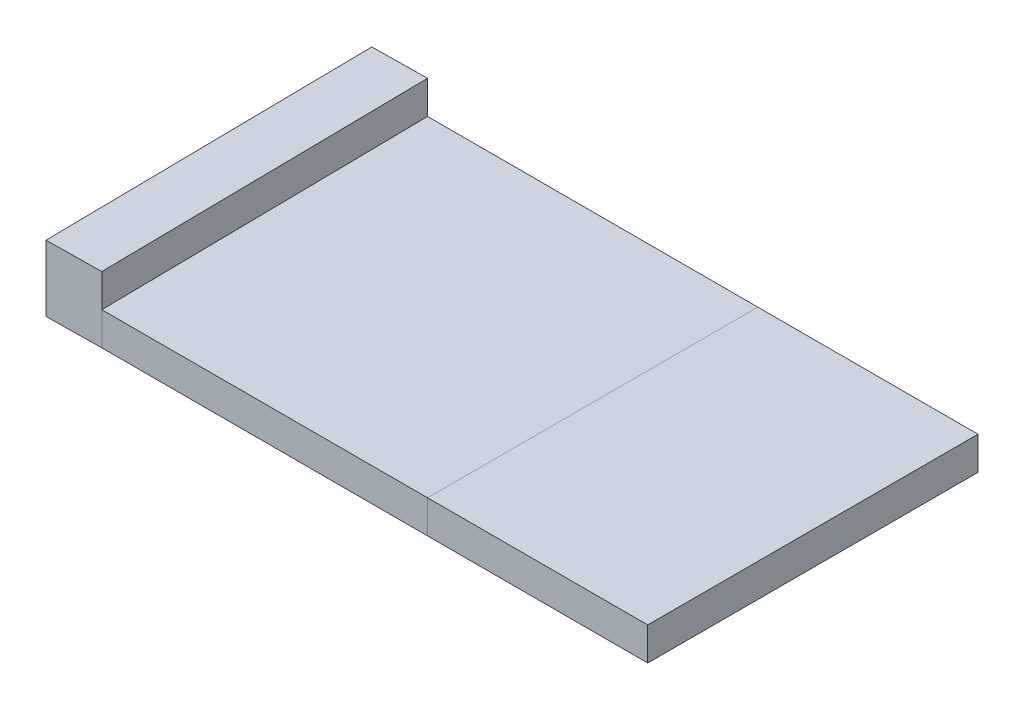
ISO-10303-21;
HEADER;
FILE_DESCRIPTION(('STEP AP214'),'2;1');
FILE_NAME('part.step','',(''),(''),'','','');
FILE_SCHEMA(('AUTOMOTIVE_DESIGN { 1 0 10303 214 1 1 1 1 }'));
ENDSEC;
DATA;
#1=APPLICATION_CONTEXT('core data for automotive mechanical design processes');
#2=APPLICATION_PROTOCOL_DEFINITION('international standard','automotive_design',2000,#1);
#3=PRODUCT_CONTEXT('',#1,'mechanical');
#4=PRODUCT('Part','Part','',(#3));
#5=PRODUCT_RELATED_PRODUCT_CATEGORY('part','',(#4));
#6=PRODUCT_DEFINITION_FORMATION('','',#4);
#7=PRODUCT_DEFINITION_CONTEXT('part definition',#1,'design');
#8=PRODUCT_DEFINITION('design','',#6,#7);
#9=PRODUCT_DEFINITION_SHAPE('','',#8);
#10=(LENGTH_UNIT() NAMED_UNIT(*) SI_UNIT(.MILLI.,.METRE.));
#11=(NAMED_UNIT(*) PLANE_ANGLE_UNIT() SI_UNIT($,.RADIAN.));
#12=(NAMED_UNIT(*) SI_UNIT($,.STERADIAN.) SOLID_ANGLE_UNIT());
#13=UNCERTAINTY_MEASURE_WITH_UNIT(LENGTH_MEASURE(1.E-05),#10,'distance_accuracy_value','');
#14=(GEOMETRIC_REPRESENTATION_CONTEXT(3) GLOBAL_UNCERTAINTY_ASSIGNED_CONTEXT((#13)) GLOBAL_UNIT_ASSIGNED_CONTEXT((#10,
#11,#12)) REPRESENTATION_CONTEXT('',''));
#15=CARTESIAN_POINT('',(0.,0.,0.));
#16=DIRECTION('',(0.,0.,1.));
#17=DIRECTION('',(1.,0.,0.));
#18=AXIS2_PLACEMENT_3D('',#15,#16,#17);
#19=CARTESIAN_POINT('',(495.953237410072,30.,0.));
#20=DIRECTION('',(0.,0.,-1.));
#21=DIRECTION('',(-1.,0.,0.));
#22=AXIS2_PLACEMENT_3D('',#19,#20,#21);
#23=PLANE('',#22);
#24=DIRECTION('',(0.,-1.,0.));
#25=VECTOR('',#24,1.);
#26=CARTESIAN_POINT('',(295.953237410072,30.,0.));
#27=LINE('',#26,#25);
#28=CARTESIAN_POINT('',(295.953237410072,30.,0.));
#29=VERTEX_POINT('',#28);
#30=CARTESIAN_POINT('',(295.953237410072,0.,0.));
#31=VERTEX_POINT('',#30);
#32=EDGE_CURVE('E108',#29,#31,#27,.T.);
#33=ORIENTED_EDGE('',*,*,#32,.T.);
#34=DIRECTION('',(-1.,0.,0.));
#35=VECTOR('',#34,1.);
#36=CARTESIAN_POINT('',(495.953237410072,0.,0.));
#37=LINE('',#36,#35);
#38=CARTESIAN_POINT('',(495.953237410072,0.,0.));
#39=VERTEX_POINT('',#38);
#40=EDGE_CURVE('E12',#39,#31,#37,.T.);
#41=ORIENTED_EDGE('',*,*,#40,.F.);
#42=DIRECTION('',(0.,-1.,0.));
#43=VECTOR('',#42,1.);
#44=CARTESIAN_POINT('',(495.953237410072,30.,0.));
#45=LINE('',#44,#43);
#46=CARTESIAN_POINT('',(495.953237410072,30.,0.));
#47=VERTEX_POINT('',#46);
#48=EDGE_CURVE('E96',#47,#39,#45,.T.);
#49=ORIENTED_EDGE('',*,*,#48,.F.);
#50=DIRECTION('',(-1.,0.,0.));
#51=VECTOR('',#50,1.);
#52=CARTESIAN_POINT('',(495.953237410072,30.,0.));
#53=LINE('',#52,#51);
#54=EDGE_CURVE('E104',#47,#29,#53,.T.);
#55=ORIENTED_EDGE('',*,*,#54,.T.);
#56=EDGE_LOOP('',(#33,#41,#49,#55));
#57=FACE_BOUND('',#56,.T.);
#58=ADVANCED_FACE('F45',(#57),#23,.F.);
#59=CARTESIAN_POINT('',(495.953237410072,0.,0.));
#60=DIRECTION('',(0.,1.,0.));
#61=DIRECTION('',(0.,0.,1.));
#62=AXIS2_PLACEMENT_3D('',#59,#60,#61);
#63=PLANE('',#62);
#64=DIRECTION('',(0.,0.,-1.));
#65=VECTOR('',#64,1.);
#66=CARTESIAN_POINT('',(295.953237410072,0.,0.));
#67=LINE('',#66,#65);
#68=CARTESIAN_POINT('',(295.953237410072,0.,-300.));
#69=VERTEX_POINT('',#68);
#70=EDGE_CURVE('E100',#31,#69,#67,.T.);
#71=ORIENTED_EDGE('',*,*,#70,.T.);
#72=DIRECTION('',(-1.,0.,0.));
#73=VECTOR('',#72,1.);
#74=CARTESIAN_POINT('',(495.953237410072,0.,-300.));
#75=LINE('',#74,#73);
#76=CARTESIAN_POINT('',(495.953237410072,0.,-300.));
#77=VERTEX_POINT('',#76);
#78=EDGE_CURVE('E53',#77,#69,#75,.T.);
#79=ORIENTED_EDGE('',*,*,#78,.F.);
#80=DIRECTION('',(0.,0.,-1.));
#81=VECTOR('',#80,1.);
#82=CARTESIAN_POINT('',(495.953237410072,0.,0.));
#83=LINE('',#82,#81);
#84=EDGE_CURVE('E91',#39,#77,#83,.T.);
#85=ORIENTED_EDGE('',*,*,#84,.F.);
#86=ORIENTED_EDGE('',*,*,#40,.T.);
#87=EDGE_LOOP('',(#71,#79,#85,#86));
#88=FACE_BOUND('',#87,.T.);
#89=ADVANCED_FACE('F99',(#88),#63,.F.);
#90=CARTESIAN_POINT('',(495.953237410072,0.,-300.));
#91=DIRECTION('',(0.,0.,1.));
#92=DIRECTION('',(1.,0.,0.));
#93=AXIS2_PLACEMENT_3D('',#90,#91,#92);
#94=PLANE('',#93);
#95=DIRECTION('',(0.,1.,0.));
#96=VECTOR('',#95,1.);
#97=CARTESIAN_POINT('',(295.953237410072,0.,-300.));
#98=LINE('',#97,#96);
#99=CARTESIAN_POINT('',(295.953237410072,30.,-300.));
#100=VERTEX_POINT('',#99);
#101=EDGE_CURVE('E78',#69,#100,#98,.T.);
#102=ORIENTED_EDGE('',*,*,#101,.T.);
#103=DIRECTION('',(-1.,0.,0.));
#104=VECTOR('',#103,1.);
#105=CARTESIAN_POINT('',(495.953237410072,30.,-300.));
#106=LINE('',#105,#104);
#107=CARTESIAN_POINT('',(495.953237410072,30.,-300.));
#108=VERTEX_POINT('',#107);
#109=EDGE_CURVE('E101',#108,#100,#106,.T.);
#110=ORIENTED_EDGE('',*,*,#109,.F.);
#111=DIRECTION('',(0.,1.,0.));
#112=VECTOR('',#111,1.);
#113=CARTESIAN_POINT('',(495.953237410072,0.,-300.));
#114=LINE('',#113,#112);
#115=EDGE_CURVE('E94',#77,#108,#114,.T.);
#116=ORIENTED_EDGE('',*,*,#115,.F.);
#117=ORIENTED_EDGE('',*,*,#78,.T.);
#118=EDGE_LOOP('',(#102,#110,#116,#117));
#119=FACE_BOUND('',#118,.T.);
#120=ADVANCED_FACE('F102',(#119),#94,.F.);
#121=CARTESIAN_POINT('',(495.953237410072,30.,-300.));
#122=DIRECTION('',(0.,-1.,0.));
#123=DIRECTION('',(0.,0.,-1.));
#124=AXIS2_PLACEMENT_3D('',#121,#122,#123);
#125=PLANE('',#124);
#126=DIRECTION('',(0.,0.,1.));
#127=VECTOR('',#126,1.);
#128=CARTESIAN_POINT('',(295.953237410072,30.,-300.));
#129=LINE('',#128,#127);
#130=EDGE_CURVE('E84',#100,#29,#129,.T.);
#131=ORIENTED_EDGE('',*,*,#130,.T.);
#132=ORIENTED_EDGE('',*,*,#54,.F.);
#133=DIRECTION('',(0.,0.,1.));
#134=VECTOR('',#133,1.);
#135=CARTESIAN_POINT('',(495.953237410072,30.,-300.));
#136=LINE('',#135,#134);
#137=EDGE_CURVE('E61',#108,#47,#136,.T.);
#138=ORIENTED_EDGE('',*,*,#137,.F.);
#139=ORIENTED_EDGE('',*,*,#109,.T.);
#140=EDGE_LOOP('',(#131,#132,#138,#139));
#141=FACE_BOUND('',#140,.T.);
#142=ADVANCED_FACE('F115',(#141),#125,.F.);
#143=CARTESIAN_POINT('',(495.953237410072,0.,0.));
#144=DIRECTION('',(1.,0.,0.));
#145=DIRECTION('',(0.,0.,-1.));
#146=AXIS2_PLACEMENT_3D('',#143,#144,#145);
#147=PLANE('',#146);
#148=ORIENTED_EDGE('',*,*,#48,.T.);
#149=ORIENTED_EDGE('',*,*,#84,.T.);
#150=ORIENTED_EDGE('',*,*,#115,.T.);
#151=ORIENTED_EDGE('',*,*,#137,.T.);
#152=EDGE_LOOP('',(#148,#149,#150,#151));
#153=FACE_BOUND('',#152,.T.);
#154=ADVANCED_FACE('F92',(#153),#147,.T.);
#155=CARTESIAN_POINT('',(295.953237410072,0.,0.));
#156=DIRECTION('',(1.,0.,0.));
#157=DIRECTION('',(0.,0.,-1.));
#158=AXIS2_PLACEMENT_3D('',#155,#156,#157);
#159=PLANE('',#158);
#160=ORIENTED_EDGE('',*,*,#32,.F.);
#161=ORIENTED_EDGE('',*,*,#130,.F.);
#162=ORIENTED_EDGE('',*,*,#101,.F.);
#163=ORIENTED_EDGE('',*,*,#70,.F.);
#164=EDGE_LOOP('',(#160,#161,#162,#163));
#165=FACE_BOUND('',#164,.T.);
#166=ADVANCED_FACE('F118',(#165),#159,.F.);
#167=CLOSED_SHELL('',(#58,#89,#120,#142,#154,#166));
#168=MANIFOLD_SOLID_BREP('B2',#167);
#169=CARTESIAN_POINT('',(0.,30.,0.));
#170=DIRECTION('',(0.,0.,-1.));
#171=DIRECTION('',(-1.,0.,0.));
#172=AXIS2_PLACEMENT_3D('',#169,#170,#171);
#173=PLANE('',#172);
#174=DIRECTION('',(1.,0.,0.));
#175=VECTOR('',#174,1.);
#176=CARTESIAN_POINT('',(0.,0.,0.));
#177=LINE('',#176,#175);
#178=CARTESIAN_POINT('',(0.,0.,0.));
#179=VERTEX_POINT('',#178);
#180=CARTESIAN_POINT('',(295.953237410072,0.,0.));
#181=VERTEX_POINT('',#180);
#182=EDGE_CURVE('E196',#179,#181,#177,.T.);
#183=ORIENTED_EDGE('',*,*,#182,.T.);
#184=DIRECTION('',(0.,-1.,0.));
#185=VECTOR('',#184,1.);
#186=CARTESIAN_POINT('',(295.953237410072,30.,0.));
#187=LINE('',#186,#185);
#188=CARTESIAN_POINT('',(295.953237410072,30.,0.));
#189=VERTEX_POINT('',#188);
#190=EDGE_CURVE('E177',#189,#181,#187,.T.);
#191=ORIENTED_EDGE('',*,*,#190,.F.);
#192=DIRECTION('',(1.,0.,0.));
#193=VECTOR('',#192,1.);
#194=CARTESIAN_POINT('',(0.,30.,0.));
#195=LINE('',#194,#193);
#196=CARTESIAN_POINT('',(0.,30.,0.));
#197=VERTEX_POINT('',#196);
#198=EDGE_CURVE('E233',#197,#189,#195,.T.);
#199=ORIENTED_EDGE('',*,*,#198,.F.);
#200=DIRECTION('',(0.,-1.,0.));
#201=VECTOR('',#200,1.);
#202=CARTESIAN_POINT('',(0.,30.,0.));
#203=LINE('',#202,#201);
#204=EDGE_CURVE('E43',#197,#179,#203,.T.);
#205=ORIENTED_EDGE('',*,*,#204,.T.);
#206=EDGE_LOOP('',(#183,#191,#199,#205));
#207=FACE_BOUND('',#206,.T.);
#208=ADVANCED_FACE('F169',(#207),#173,.F.);
#209=CARTESIAN_POINT('',(295.953237410072,30.,0.));
#210=DIRECTION('',(-1.,0.,0.));
#211=DIRECTION('',(0.,0.,1.));
#212=AXIS2_PLACEMENT_3D('',#209,#210,#211);
#213=PLANE('',#212);
#214=DIRECTION('',(0.,0.,-1.));
#215=VECTOR('',#214,1.);
#216=CARTESIAN_POINT('',(295.953237410072,0.,0.));
#217=LINE('',#216,#215);
#218=CARTESIAN_POINT('',(295.953237410072,0.,-300.));
#219=VERTEX_POINT('',#218);
#220=EDGE_CURVE('E242',#181,#219,#217,.T.);
#221=ORIENTED_EDGE('',*,*,#220,.T.);
#222=DIRECTION('',(0.,-1.,0.));
#223=VECTOR('',#222,1.);
#224=CARTESIAN_POINT('',(295.953237410072,30.,-300.));
#225=LINE('',#224,#223);
#226=CARTESIAN_POINT('',(295.953237410072,30.,-300.));
#227=VERTEX_POINT('',#226);
#228=EDGE_CURVE('E254',#227,#219,#225,.T.);
#229=ORIENTED_EDGE('',*,*,#228,.F.);
#230=DIRECTION('',(0.,0.,-1.));
#231=VECTOR('',#230,1.);
#232=CARTESIAN_POINT('',(295.953237410072,30.,0.));
#233=LINE('',#232,#231);
#234=EDGE_CURVE('E185',#189,#227,#233,.T.);
#235=ORIENTED_EDGE('',*,*,#234,.F.);
#236=ORIENTED_EDGE('',*,*,#190,.T.);
#237=EDGE_LOOP('',(#221,#229,#235,#236));
#238=FACE_BOUND('',#237,.T.);
#239=ADVANCED_FACE('F258',(#238),#213,.F.);
#240=CARTESIAN_POINT('',(295.953237410072,30.,-300.));
#241=DIRECTION('',(0.,0.,1.));
#242=DIRECTION('',(1.,0.,0.));
#243=AXIS2_PLACEMENT_3D('',#240,#241,#242);
#244=PLANE('',#243);
#245=DIRECTION('',(-1.,0.,0.));
#246=VECTOR('',#245,1.);
#247=CARTESIAN_POINT('',(295.953237410072,0.,-300.));
#248=LINE('',#247,#246);
#249=CARTESIAN_POINT('',(-4.04676258992808,0.,-300.));
#250=VERTEX_POINT('',#249);
#251=EDGE_CURVE('E239',#219,#250,#248,.T.);
#252=ORIENTED_EDGE('',*,*,#251,.T.);
#253=DIRECTION('',(0.,-1.,0.));
#254=VECTOR('',#253,1.);
#255=CARTESIAN_POINT('',(-4.04676258992808,30.,-300.));
#256=LINE('',#255,#254);
#257=CARTESIAN_POINT('',(-4.04676258992808,30.,-300.));
#258=VERTEX_POINT('',#257);
#259=EDGE_CURVE('E249',#258,#250,#256,.T.);
#260=ORIENTED_EDGE('',*,*,#259,.F.);
#261=DIRECTION('',(-1.,0.,0.));
#262=VECTOR('',#261,1.);
#263=CARTESIAN_POINT('',(295.953237410072,30.,-300.));
#264=LINE('',#263,#262);
#265=EDGE_CURVE('E237',#227,#258,#264,.T.);
#266=ORIENTED_EDGE('',*,*,#265,.F.);
#267=ORIENTED_EDGE('',*,*,#228,.T.);
#268=EDGE_LOOP('',(#252,#260,#266,#267));
#269=FACE_BOUND('',#268,.T.);
#270=ADVANCED_FACE('F267',(#269),#244,.F.);
#271=CARTESIAN_POINT('',(0.,30.,0.));
#272=DIRECTION('',(0.,1.,0.));
#273=DIRECTION('',(0.,0.,1.));
#274=AXIS2_PLACEMENT_3D('',#271,#272,#273);
#275=PLANE('',#274);
#276=DIRECTION('',(0.0134879815607808,0.,0.999909033039214));
#277=VECTOR('',#276,1.);
#278=CARTESIAN_POINT('',(-4.04676258992808,30.,-300.));
#279=LINE('',#278,#277);
#280=EDGE_CURVE('E206',#258,#197,#279,.T.);
#281=ORIENTED_EDGE('',*,*,#280,.T.);
#282=ORIENTED_EDGE('',*,*,#198,.T.);
#283=ORIENTED_EDGE('',*,*,#234,.T.);
#284=ORIENTED_EDGE('',*,*,#265,.T.);
#285=EDGE_LOOP('',(#281,#282,#283,#284));
#286=FACE_BOUND('',#285,.T.);
#287=ADVANCED_FACE('F235',(#286),#275,.T.);
#288=CARTESIAN_POINT('',(0.,0.,0.));
#289=DIRECTION('',(0.,1.,0.));
#290=DIRECTION('',(0.,0.,1.));
#291=AXIS2_PLACEMENT_3D('',#288,#289,#290);
#292=PLANE('',#291);
#293=ORIENTED_EDGE('',*,*,#182,.F.);
#294=DIRECTION('',(0.999909033039214,0.,-0.0134879815607808));
#295=VECTOR('',#294,1.);
#296=CARTESIAN_POINT('',(-49.9954516519607,0.,0.674399078039042));
#297=LINE('',#296,#295);
#298=CARTESIAN_POINT('',(-49.9954516519607,0.,0.674399078039042));
#299=VERTEX_POINT('',#298);
#300=EDGE_CURVE('E226',#299,#179,#297,.T.);
#301=ORIENTED_EDGE('',*,*,#300,.F.);
#302=DIRECTION('',(0.0134879815607808,0.,0.999909033039214));
#303=VECTOR('',#302,1.);
#304=CARTESIAN_POINT('',(-54.0422142418888,0.,-299.325600921961));
#305=LINE('',#304,#303);
#306=CARTESIAN_POINT('',(-54.0422142418888,0.,-299.325600921961));
#307=VERTEX_POINT('',#306);
#308=EDGE_CURVE('E288',#307,#299,#305,.T.);
#309=ORIENTED_EDGE('',*,*,#308,.F.);
#310=DIRECTION('',(0.999909033039214,0.,-0.0134879815607808));
#311=VECTOR('',#310,1.);
#312=CARTESIAN_POINT('',(-54.0422142418888,0.,-299.325600921961));
#313=LINE('',#312,#311);
#314=EDGE_CURVE('E265',#307,#250,#313,.T.);
#315=ORIENTED_EDGE('',*,*,#314,.T.);
#316=ORIENTED_EDGE('',*,*,#251,.F.);
#317=ORIENTED_EDGE('',*,*,#220,.F.);
#318=EDGE_LOOP('',(#293,#301,#309,#315,#316,#317));
#319=FACE_BOUND('',#318,.T.);
#320=ADVANCED_FACE('F261',(#319),#292,.F.);
#321=CARTESIAN_POINT('',(-49.9954516519607,0.,0.674399078039042));
#322=DIRECTION('',(-0.0134879815607808,0.,-0.999909033039214));
#323=DIRECTION('',(-0.999909033039214,0.,0.0134879815607808));
#324=AXIS2_PLACEMENT_3D('',#321,#322,#323);
#325=PLANE('',#324);
#326=ORIENTED_EDGE('',*,*,#204,.F.);
#327=DIRECTION('',(0.,1.,0.));
#328=VECTOR('',#327,1.);
#329=CARTESIAN_POINT('',(0.,0.,0.));
#330=LINE('',#329,#328);
#331=CARTESIAN_POINT('',(0.,60.,0.));
#332=VERTEX_POINT('',#331);
#333=EDGE_CURVE('E221',#197,#332,#330,.T.);
#334=ORIENTED_EDGE('',*,*,#333,.T.);
#335=DIRECTION('',(0.999909033039214,0.,-0.0134879815607808));
#336=VECTOR('',#335,1.);
#337=CARTESIAN_POINT('',(-49.9954516519607,60.,0.674399078039042));
#338=LINE('',#337,#336);
#339=CARTESIAN_POINT('',(-49.9954516519607,60.,0.674399078039042));
#340=VERTEX_POINT('',#339);
#341=EDGE_CURVE('E290',#340,#332,#338,.T.);
#342=ORIENTED_EDGE('',*,*,#341,.F.);
#343=DIRECTION('',(0.,1.,0.));
#344=VECTOR('',#343,1.);
#345=CARTESIAN_POINT('',(-49.9954516519607,0.,0.674399078039042));
#346=LINE('',#345,#344);
#347=EDGE_CURVE('E284',#299,#340,#346,.T.);
#348=ORIENTED_EDGE('',*,*,#347,.F.);
#349=ORIENTED_EDGE('',*,*,#300,.T.);
#350=EDGE_LOOP('',(#326,#334,#342,#348,#349));
#351=FACE_BOUND('',#350,.T.);
#352=ADVANCED_FACE('F218',(#351),#325,.F.);
#353=CARTESIAN_POINT('',(-49.9954516519607,60.,0.674399078039042));
#354=DIRECTION('',(0.,-1.,0.));
#355=DIRECTION('',(0.,0.,-1.));
#356=AXIS2_PLACEMENT_3D('',#353,#354,#355);
#357=PLANE('',#356);
#358=DIRECTION('',(-0.0134879815607808,0.,-0.999909033039214));
#359=VECTOR('',#358,1.);
#360=CARTESIAN_POINT('',(0.,60.,0.));
#361=LINE('',#360,#359);
#362=CARTESIAN_POINT('',(-4.04676258992808,60.,-300.));
#363=VERTEX_POINT('',#362);
#364=EDGE_CURVE('E231',#332,#363,#361,.T.);
#365=ORIENTED_EDGE('',*,*,#364,.T.);
#366=DIRECTION('',(0.999909033039214,0.,-0.0134879815607808));
#367=VECTOR('',#366,1.);
#368=CARTESIAN_POINT('',(-54.0422142418888,60.,-299.325600921961));
#369=LINE('',#368,#367);
#370=CARTESIAN_POINT('',(-54.0422142418888,60.,-299.325600921961));
#371=VERTEX_POINT('',#370);
#372=EDGE_CURVE('E291',#371,#363,#369,.T.);
#373=ORIENTED_EDGE('',*,*,#372,.F.);
#374=DIRECTION('',(-0.0134879815607808,0.,-0.999909033039214));
#375=VECTOR('',#374,1.);
#376=CARTESIAN_POINT('',(-49.9954516519607,60.,0.674399078039042));
#377=LINE('',#376,#375);
#378=EDGE_CURVE('E287',#340,#371,#377,.T.);
#379=ORIENTED_EDGE('',*,*,#378,.F.);
#380=ORIENTED_EDGE('',*,*,#341,.T.);
#381=EDGE_LOOP('',(#365,#373,#379,#380));
#382=FACE_BOUND('',#381,.T.);
#383=ADVANCED_FACE('F292',(#382),#357,.F.);
#384=CARTESIAN_POINT('',(-54.0422142418888,60.,-299.325600921961));
#385=DIRECTION('',(0.0134879815607808,0.,0.999909033039214));
#386=DIRECTION('',(0.999909033039214,0.,-0.0134879815607808));
#387=AXIS2_PLACEMENT_3D('',#384,#385,#386);
#388=PLANE('',#387);
#389=DIRECTION('',(0.,-1.,0.));
#390=VECTOR('',#389,1.);
#391=CARTESIAN_POINT('',(-4.04676258992808,60.,-300.));
#392=LINE('',#391,#390);
#393=EDGE_CURVE('E300',#363,#258,#392,.T.);
#394=ORIENTED_EDGE('',*,*,#393,.T.);
#395=ORIENTED_EDGE('',*,*,#259,.T.);
#396=ORIENTED_EDGE('',*,*,#314,.F.);
#397=DIRECTION('',(0.,-1.,0.));
#398=VECTOR('',#397,1.);
#399=CARTESIAN_POINT('',(-54.0422142418888,60.,-299.325600921961));
#400=LINE('',#399,#398);
#401=EDGE_CURVE('E294',#371,#307,#400,.T.);
#402=ORIENTED_EDGE('',*,*,#401,.F.);
#403=ORIENTED_EDGE('',*,*,#372,.T.);
#404=EDGE_LOOP('',(#394,#395,#396,#402,#403));
#405=FACE_BOUND('',#404,.T.);
#406=ADVANCED_FACE('F303',(#405),#388,.F.);
#407=CARTESIAN_POINT('',(-49.9954516519607,0.,0.674399078039042));
#408=DIRECTION('',(-0.999909033039214,0.,0.0134879815607808));
#409=DIRECTION('',(0.0134879815607808,0.,0.999909033039214));
#410=AXIS2_PLACEMENT_3D('',#407,#408,#409);
#411=PLANE('',#410);
#412=ORIENTED_EDGE('',*,*,#308,.T.);
#413=ORIENTED_EDGE('',*,*,#347,.T.);
#414=ORIENTED_EDGE('',*,*,#378,.T.);
#415=ORIENTED_EDGE('',*,*,#401,.T.);
#416=EDGE_LOOP('',(#412,#413,#414,#415));
#417=FACE_BOUND('',#416,.T.);
#418=ADVANCED_FACE('F285',(#417),#411,.T.);
#419=CARTESIAN_POINT('',(0.,0.,0.));
#420=DIRECTION('',(-0.999909033039214,0.,0.0134879815607808));
#421=DIRECTION('',(0.0134879815607808,0.,0.999909033039214));
#422=AXIS2_PLACEMENT_3D('',#419,#420,#421);
#423=PLANE('',#422);
#424=ORIENTED_EDGE('',*,*,#280,.F.);
#425=ORIENTED_EDGE('',*,*,#393,.F.);
#426=ORIENTED_EDGE('',*,*,#364,.F.);
#427=ORIENTED_EDGE('',*,*,#333,.F.);
#428=EDGE_LOOP('',(#424,#425,#426,#427));
#429=FACE_BOUND('',#428,.T.);
#430=ADVANCED_FACE('F229',(#429),#423,.F.);
#431=CLOSED_SHELL('',(#208,#239,#270,#287,#320,#352,#383,#406,#418,#430));
#432=MANIFOLD_SOLID_BREP('B6',#431);
#433=ADVANCED_BREP_SHAPE_REPRESENTATION('',(#18,#168,#432),#14);
#434=SHAPE_DEFINITION_REPRESENTATION(#9,#433);
ENDSEC;
END-ISO-10303-21;
